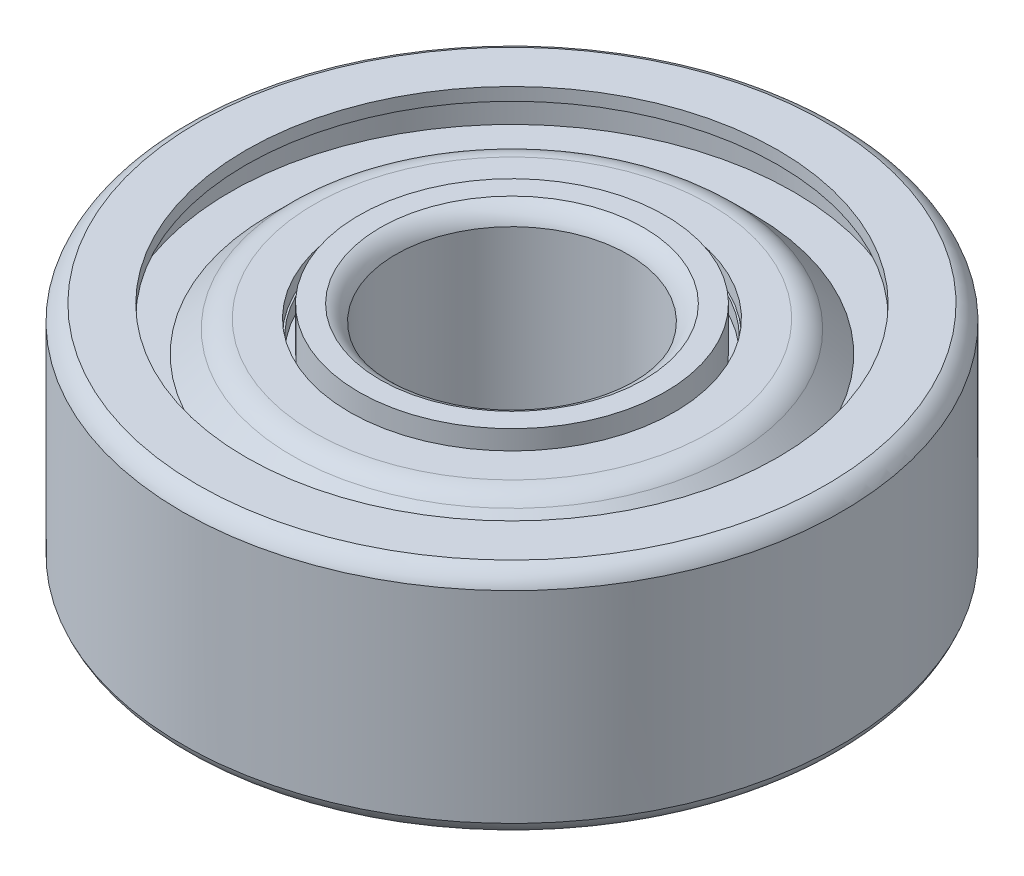
ISO-10303-21;
HEADER;
FILE_DESCRIPTION(('STEP AP214'),'2;1');
FILE_NAME('part.step','',(''),(''),'','','');
FILE_SCHEMA(('AUTOMOTIVE_DESIGN { 1 0 10303 214 1 1 1 1 }'));
ENDSEC;
DATA;
#1=APPLICATION_CONTEXT('core data for automotive mechanical design processes');
#2=APPLICATION_PROTOCOL_DEFINITION('international standard','automotive_design',2000,#1);
#3=PRODUCT_CONTEXT('',#1,'mechanical');
#4=PRODUCT('Part','Part','',(#3));
#5=PRODUCT_RELATED_PRODUCT_CATEGORY('part','',(#4));
#6=PRODUCT_DEFINITION_FORMATION('','',#4);
#7=PRODUCT_DEFINITION_CONTEXT('part definition',#1,'design');
#8=PRODUCT_DEFINITION('design','',#6,#7);
#9=PRODUCT_DEFINITION_SHAPE('','',#8);
#10=(LENGTH_UNIT() NAMED_UNIT(*) SI_UNIT(.MILLI.,.METRE.));
#11=(NAMED_UNIT(*) PLANE_ANGLE_UNIT() SI_UNIT($,.RADIAN.));
#12=(NAMED_UNIT(*) SI_UNIT($,.STERADIAN.) SOLID_ANGLE_UNIT());
#13=UNCERTAINTY_MEASURE_WITH_UNIT(LENGTH_MEASURE(1.E-05),#10,'distance_accuracy_value','');
#14=(GEOMETRIC_REPRESENTATION_CONTEXT(3) GLOBAL_UNCERTAINTY_ASSIGNED_CONTEXT((#13)) GLOBAL_UNIT_ASSIGNED_CONTEXT((#10,
#11,#12)) REPRESENTATION_CONTEXT('',''));
#15=CARTESIAN_POINT('',(0.,0.,0.));
#16=DIRECTION('',(0.,0.,1.));
#17=DIRECTION('',(1.,0.,0.));
#18=AXIS2_PLACEMENT_3D('',#15,#16,#17);
#19=CARTESIAN_POINT('',(0.,0.,0.));
#20=DIRECTION('',(0.,1.,0.));
#21=DIRECTION('',(0.,0.,1.));
#22=AXIS2_PLACEMENT_3D('',#19,#20,#21);
#23=CYLINDRICAL_SURFACE('',#22,3.);
#24=CARTESIAN_POINT('',(0.,5.60000000000008,0.));
#25=DIRECTION('',(0.,1.,0.));
#26=DIRECTION('',(0.,0.,1.));
#27=AXIS2_PLACEMENT_3D('',#24,#25,#26);
#28=CIRCLE('',#27,2.99999999999977);
#29=CARTESIAN_POINT('',(0.,5.60000000000008,2.99999999999977));
#30=VERTEX_POINT('',#29);
#31=EDGE_CURVE('E187',#30,#30,#28,.F.);
#32=ORIENTED_EDGE('',*,*,#31,.F.);
#33=EDGE_LOOP('',(#32));
#34=FACE_BOUND('',#33,.T.);
#35=CARTESIAN_POINT('',(0.,0.399999999999939,0.));
#36=DIRECTION('',(0.,-1.,0.));
#37=DIRECTION('',(0.,0.,1.));
#38=AXIS2_PLACEMENT_3D('',#35,#36,#37);
#39=CIRCLE('',#38,2.99999999999983);
#40=CARTESIAN_POINT('',(0.,0.399999999999939,2.99999999999983));
#41=VERTEX_POINT('',#40);
#42=EDGE_CURVE('E183',#41,#41,#39,.F.);
#43=ORIENTED_EDGE('',*,*,#42,.F.);
#44=EDGE_LOOP('',(#43));
#45=FACE_BOUND('',#44,.T.);
#46=ADVANCED_FACE('F16',(#34,#45),#23,.F.);
#47=CARTESIAN_POINT('',(0.,5.36637722008,0.));
#48=DIRECTION('',(0.,1.,0.));
#49=DIRECTION('',(0.,0.,1.));
#50=AXIS2_PLACEMENT_3D('',#47,#48,#49);
#51=TOROIDAL_SURFACE('',#50,3.63362277992,0.6753202429451);
#52=ORIENTED_EDGE('',*,*,#31,.T.);
#53=EDGE_LOOP('',(#52));
#54=FACE_BOUND('',#53,.T.);
#55=CARTESIAN_POINT('',(0.,6.,0.));
#56=DIRECTION('',(0.,1.,0.));
#57=DIRECTION('',(0.,0.,1.));
#58=AXIS2_PLACEMENT_3D('',#55,#56,#57);
#59=CIRCLE('',#58,3.39999999999929);
#60=CARTESIAN_POINT('',(0.,6.,3.39999999999929));
#61=VERTEX_POINT('',#60);
#62=EDGE_CURVE('E186',#61,#61,#59,.F.);
#63=ORIENTED_EDGE('',*,*,#62,.F.);
#64=EDGE_LOOP('',(#63));
#65=FACE_BOUND('',#64,.T.);
#66=ADVANCED_FACE('F177',(#54,#65),#51,.T.);
#67=CARTESIAN_POINT('',(0.,0.6336227799202,0.));
#68=DIRECTION('',(0.,-1.,0.));
#69=DIRECTION('',(0.,0.,1.));
#70=AXIS2_PLACEMENT_3D('',#67,#68,#69);
#71=TOROIDAL_SURFACE('',#70,3.63362277992,0.6753202429451);
#72=ORIENTED_EDGE('',*,*,#42,.T.);
#73=EDGE_LOOP('',(#72));
#74=FACE_BOUND('',#73,.T.);
#75=CARTESIAN_POINT('',(0.,0.,0.));
#76=DIRECTION('',(0.,-1.,0.));
#77=DIRECTION('',(0.,0.,-1.));
#78=AXIS2_PLACEMENT_3D('',#75,#76,#77);
#79=CIRCLE('',#78,3.39999999999983);
#80=CARTESIAN_POINT('',(0.,0.,-3.39999999999983));
#81=VERTEX_POINT('',#80);
#82=EDGE_CURVE('E262',#81,#81,#79,.T.);
#83=ORIENTED_EDGE('',*,*,#82,.T.);
#84=EDGE_LOOP('',(#83));
#85=FACE_BOUND('',#84,.T.);
#86=ADVANCED_FACE('F174',(#74,#85),#71,.T.);
#87=CARTESIAN_POINT('',(0.,6.,0.));
#88=DIRECTION('',(0.,1.,0.));
#89=DIRECTION('',(0.,0.,1.));
#90=AXIS2_PLACEMENT_3D('',#87,#88,#89);
#91=PLANE('',#90);
#92=ORIENTED_EDGE('',*,*,#62,.T.);
#93=EDGE_LOOP('',(#92));
#94=FACE_BOUND('',#93,.T.);
#95=CARTESIAN_POINT('',(0.,6.,0.));
#96=DIRECTION('',(0.,1.,0.));
#97=DIRECTION('',(0.,0.,1.));
#98=AXIS2_PLACEMENT_3D('',#95,#96,#97);
#99=CIRCLE('',#98,3.948957610706);
#100=CARTESIAN_POINT('',(0.,6.,3.948957610706));
#101=VERTEX_POINT('',#100);
#102=EDGE_CURVE('E259',#101,#101,#99,.F.);
#103=ORIENTED_EDGE('',*,*,#102,.F.);
#104=EDGE_LOOP('',(#103));
#105=FACE_BOUND('',#104,.T.);
#106=ADVANCED_FACE('F170',(#94,#105),#91,.T.);
#107=CARTESIAN_POINT('',(0.,0.,0.));
#108=DIRECTION('',(0.,1.,0.));
#109=DIRECTION('',(0.,0.,1.));
#110=AXIS2_PLACEMENT_3D('',#107,#108,#109);
#111=PLANE('',#110);
#112=ORIENTED_EDGE('',*,*,#82,.F.);
#113=EDGE_LOOP('',(#112));
#114=FACE_BOUND('',#113,.T.);
#115=CARTESIAN_POINT('',(0.,0.,0.));
#116=DIRECTION('',(0.,-1.,0.));
#117=DIRECTION('',(0.,0.,-1.));
#118=AXIS2_PLACEMENT_3D('',#115,#116,#117);
#119=CIRCLE('',#118,3.948957610706);
#120=CARTESIAN_POINT('',(0.,0.,-3.948957610706));
#121=VERTEX_POINT('',#120);
#122=EDGE_CURVE('E256',#121,#121,#119,.F.);
#123=ORIENTED_EDGE('',*,*,#122,.F.);
#124=EDGE_LOOP('',(#123));
#125=FACE_BOUND('',#124,.T.);
#126=ADVANCED_FACE('F166',(#114,#125),#111,.F.);
#127=CARTESIAN_POINT('',(0.,5.6698,0.));
#128=DIRECTION('',(0.,1.,0.));
#129=DIRECTION('',(0.,0.,1.));
#130=AXIS2_PLACEMENT_3D('',#127,#128,#129);
#131=CYLINDRICAL_SURFACE('',#130,3.948957610706);
#132=ORIENTED_EDGE('',*,*,#102,.T.);
#133=EDGE_LOOP('',(#132));
#134=FACE_BOUND('',#133,.T.);
#135=CARTESIAN_POINT('',(0.,4.8698,0.));
#136=DIRECTION('',(0.,1.,0.));
#137=DIRECTION('',(0.,0.,1.));
#138=AXIS2_PLACEMENT_3D('',#135,#136,#137);
#139=CIRCLE('',#138,3.948957610706);
#140=CARTESIAN_POINT('',(0.,4.8698,3.948957610706));
#141=VERTEX_POINT('',#140);
#142=EDGE_CURVE('E253',#141,#141,#139,.F.);
#143=ORIENTED_EDGE('',*,*,#142,.F.);
#144=EDGE_LOOP('',(#143));
#145=FACE_BOUND('',#144,.T.);
#146=ADVANCED_FACE('F162',(#134,#145),#131,.T.);
#147=CARTESIAN_POINT('',(0.,0.3302,0.));
#148=DIRECTION('',(0.,-1.,0.));
#149=DIRECTION('',(0.,0.,-1.));
#150=AXIS2_PLACEMENT_3D('',#147,#148,#149);
#151=CYLINDRICAL_SURFACE('',#150,3.948957610706);
#152=ORIENTED_EDGE('',*,*,#122,.T.);
#153=EDGE_LOOP('',(#152));
#154=FACE_BOUND('',#153,.T.);
#155=CARTESIAN_POINT('',(0.,1.1302,0.));
#156=DIRECTION('',(0.,-1.,0.));
#157=DIRECTION('',(0.,0.,-1.));
#158=AXIS2_PLACEMENT_3D('',#155,#156,#157);
#159=CIRCLE('',#158,3.948957610706);
#160=CARTESIAN_POINT('',(0.,1.1302,-3.948957610706));
#161=VERTEX_POINT('',#160);
#162=EDGE_CURVE('E250',#161,#161,#159,.F.);
#163=ORIENTED_EDGE('',*,*,#162,.F.);
#164=EDGE_LOOP('',(#163));
#165=FACE_BOUND('',#164,.T.);
#166=ADVANCED_FACE('F158',(#154,#165),#151,.T.);
#167=CARTESIAN_POINT('',(0.,4.8698,0.));
#168=DIRECTION('',(0.,1.,0.));
#169=DIRECTION('',(0.,0.,1.));
#170=AXIS2_PLACEMENT_3D('',#167,#168,#169);
#171=PLANE('',#170);
#172=ORIENTED_EDGE('',*,*,#142,.T.);
#173=EDGE_LOOP('',(#172));
#174=FACE_BOUND('',#173,.T.);
#175=CARTESIAN_POINT('',(0.,4.8698,0.));
#176=DIRECTION('',(0.,1.,0.));
#177=DIRECTION('',(0.,0.,1.));
#178=AXIS2_PLACEMENT_3D('',#175,#176,#177);
#179=CIRCLE('',#178,4.145752180368);
#180=CARTESIAN_POINT('',(0.,4.8698,4.145752180368));
#181=VERTEX_POINT('',#180);
#182=EDGE_CURVE('E247',#181,#181,#179,.T.);
#183=ORIENTED_EDGE('',*,*,#182,.T.);
#184=EDGE_LOOP('',(#183));
#185=FACE_BOUND('',#184,.T.);
#186=ADVANCED_FACE('F154',(#174,#185),#171,.T.);
#187=CARTESIAN_POINT('',(0.,1.1302,0.));
#188=DIRECTION('',(0.,-1.,0.));
#189=DIRECTION('',(0.,0.,-1.));
#190=AXIS2_PLACEMENT_3D('',#187,#188,#189);
#191=PLANE('',#190);
#192=ORIENTED_EDGE('',*,*,#162,.T.);
#193=EDGE_LOOP('',(#192));
#194=FACE_BOUND('',#193,.T.);
#195=CARTESIAN_POINT('',(0.,1.1302,0.));
#196=DIRECTION('',(0.,-1.,0.));
#197=DIRECTION('',(0.,0.,-1.));
#198=AXIS2_PLACEMENT_3D('',#195,#196,#197);
#199=CIRCLE('',#198,4.145752180368);
#200=CARTESIAN_POINT('',(0.,1.1302,-4.145752180368));
#201=VERTEX_POINT('',#200);
#202=EDGE_CURVE('E244',#201,#201,#199,.T.);
#203=ORIENTED_EDGE('',*,*,#202,.T.);
#204=EDGE_LOOP('',(#203));
#205=FACE_BOUND('',#204,.T.);
#206=ADVANCED_FACE('F150',(#194,#205),#191,.T.);
#207=CARTESIAN_POINT('',(0.,4.8698,0.));
#208=DIRECTION('',(0.,1.,0.));
#209=DIRECTION('',(0.,0.,1.));
#210=AXIS2_PLACEMENT_3D('',#207,#208,#209);
#211=CYLINDRICAL_SURFACE('',#210,4.145752180368);
#212=CARTESIAN_POINT('',(0.,5.2698,0.));
#213=DIRECTION('',(0.,1.,0.));
#214=DIRECTION('',(0.,0.,1.));
#215=AXIS2_PLACEMENT_3D('',#212,#213,#214);
#216=CIRCLE('',#215,4.145752180368);
#217=CARTESIAN_POINT('',(0.,5.2698,4.145752180368));
#218=VERTEX_POINT('',#217);
#219=EDGE_CURVE('E241',#218,#218,#216,.F.);
#220=ORIENTED_EDGE('',*,*,#219,.F.);
#221=EDGE_LOOP('',(#220));
#222=FACE_BOUND('',#221,.T.);
#223=ORIENTED_EDGE('',*,*,#182,.F.);
#224=EDGE_LOOP('',(#223));
#225=FACE_BOUND('',#224,.T.);
#226=ADVANCED_FACE('F146',(#222,#225),#211,.F.);
#227=CARTESIAN_POINT('',(0.,1.1302,0.));
#228=DIRECTION('',(0.,-1.,0.));
#229=DIRECTION('',(0.,0.,-1.));
#230=AXIS2_PLACEMENT_3D('',#227,#228,#229);
#231=CYLINDRICAL_SURFACE('',#230,4.145752180368);
#232=CARTESIAN_POINT('',(0.,0.7302,0.));
#233=DIRECTION('',(0.,-1.,0.));
#234=DIRECTION('',(0.,0.,-1.));
#235=AXIS2_PLACEMENT_3D('',#232,#233,#234);
#236=CIRCLE('',#235,4.145752180368);
#237=CARTESIAN_POINT('',(0.,0.7302,-4.145752180368));
#238=VERTEX_POINT('',#237);
#239=EDGE_CURVE('E238',#238,#238,#236,.F.);
#240=ORIENTED_EDGE('',*,*,#239,.F.);
#241=EDGE_LOOP('',(#240));
#242=FACE_BOUND('',#241,.T.);
#243=ORIENTED_EDGE('',*,*,#202,.F.);
#244=EDGE_LOOP('',(#243));
#245=FACE_BOUND('',#244,.T.);
#246=ADVANCED_FACE('F142',(#242,#245),#231,.F.);
#247=CARTESIAN_POINT('',(0.,5.2698,0.));
#248=DIRECTION('',(0.,1.,0.));
#249=DIRECTION('',(0.,0.,1.));
#250=AXIS2_PLACEMENT_3D('',#247,#248,#249);
#251=PLANE('',#250);
#252=ORIENTED_EDGE('',*,*,#219,.T.);
#253=EDGE_LOOP('',(#252));
#254=FACE_BOUND('',#253,.T.);
#255=CARTESIAN_POINT('',(0.,5.2698,0.));
#256=DIRECTION('',(0.,1.,0.));
#257=DIRECTION('',(0.,0.,1.));
#258=AXIS2_PLACEMENT_3D('',#255,#256,#257);
#259=CIRCLE('',#258,4.186537805483);
#260=CARTESIAN_POINT('',(0.,5.2698,4.186537805483));
#261=VERTEX_POINT('',#260);
#262=EDGE_CURVE('E235',#261,#261,#259,.T.);
#263=ORIENTED_EDGE('',*,*,#262,.T.);
#264=EDGE_LOOP('',(#263));
#265=FACE_BOUND('',#264,.T.);
#266=ADVANCED_FACE('F138',(#254,#265),#251,.T.);
#267=CARTESIAN_POINT('',(0.,0.7302,0.));
#268=DIRECTION('',(0.,-1.,0.));
#269=DIRECTION('',(0.,0.,-1.));
#270=AXIS2_PLACEMENT_3D('',#267,#268,#269);
#271=PLANE('',#270);
#272=ORIENTED_EDGE('',*,*,#239,.T.);
#273=EDGE_LOOP('',(#272));
#274=FACE_BOUND('',#273,.T.);
#275=CARTESIAN_POINT('',(0.,0.7302,0.));
#276=DIRECTION('',(0.,-1.,0.));
#277=DIRECTION('',(0.,0.,-1.));
#278=AXIS2_PLACEMENT_3D('',#275,#276,#277);
#279=CIRCLE('',#278,4.186537805483);
#280=CARTESIAN_POINT('',(0.,0.7302,-4.186537805483));
#281=VERTEX_POINT('',#280);
#282=EDGE_CURVE('E232',#281,#281,#279,.T.);
#283=ORIENTED_EDGE('',*,*,#282,.T.);
#284=EDGE_LOOP('',(#283));
#285=FACE_BOUND('',#284,.T.);
#286=ADVANCED_FACE('F134',(#274,#285),#271,.T.);
#287=CARTESIAN_POINT('',(0.,5.2698,0.));
#288=DIRECTION('',(0.,1.,0.));
#289=DIRECTION('',(0.,0.,1.));
#290=AXIS2_PLACEMENT_3D('',#287,#288,#289);
#291=CYLINDRICAL_SURFACE('',#290,4.186537805483);
#292=CARTESIAN_POINT('',(0.,5.6698,0.));
#293=DIRECTION('',(0.,1.,0.));
#294=DIRECTION('',(0.,0.,1.));
#295=AXIS2_PLACEMENT_3D('',#292,#293,#294);
#296=CIRCLE('',#295,4.186537805483);
#297=CARTESIAN_POINT('',(0.,5.6698,4.186537805483));
#298=VERTEX_POINT('',#297);
#299=EDGE_CURVE('E229',#298,#298,#296,.F.);
#300=ORIENTED_EDGE('',*,*,#299,.F.);
#301=EDGE_LOOP('',(#300));
#302=FACE_BOUND('',#301,.T.);
#303=ORIENTED_EDGE('',*,*,#262,.F.);
#304=EDGE_LOOP('',(#303));
#305=FACE_BOUND('',#304,.T.);
#306=ADVANCED_FACE('F130',(#302,#305),#291,.F.);
#307=CARTESIAN_POINT('',(0.,0.7302,0.));
#308=DIRECTION('',(0.,-1.,0.));
#309=DIRECTION('',(0.,0.,-1.));
#310=AXIS2_PLACEMENT_3D('',#307,#308,#309);
#311=CYLINDRICAL_SURFACE('',#310,4.186537805483);
#312=CARTESIAN_POINT('',(0.,0.3302,0.));
#313=DIRECTION('',(0.,-1.,0.));
#314=DIRECTION('',(0.,0.,-1.));
#315=AXIS2_PLACEMENT_3D('',#312,#313,#314);
#316=CIRCLE('',#315,4.186537805483);
#317=CARTESIAN_POINT('',(0.,0.3302,-4.186537805483));
#318=VERTEX_POINT('',#317);
#319=EDGE_CURVE('E51',#318,#318,#316,.F.);
#320=ORIENTED_EDGE('',*,*,#319,.F.);
#321=EDGE_LOOP('',(#320));
#322=FACE_BOUND('',#321,.T.);
#323=ORIENTED_EDGE('',*,*,#282,.F.);
#324=EDGE_LOOP('',(#323));
#325=FACE_BOUND('',#324,.T.);
#326=ADVANCED_FACE('F125',(#322,#325),#311,.F.);
#327=CARTESIAN_POINT('',(0.,5.6698,0.));
#328=DIRECTION('',(0.,1.,0.));
#329=DIRECTION('',(0.,0.,1.));
#330=AXIS2_PLACEMENT_3D('',#327,#328,#329);
#331=PLANE('',#330);
#332=ORIENTED_EDGE('',*,*,#299,.T.);
#333=EDGE_LOOP('',(#332));
#334=FACE_BOUND('',#333,.T.);
#335=CARTESIAN_POINT('',(0.,5.6698,0.));
#336=DIRECTION('',(0.,-1.,0.));
#337=DIRECTION('',(0.,0.,1.));
#338=AXIS2_PLACEMENT_3D('',#335,#336,#337);
#339=CIRCLE('',#338,5.102454019466);
#340=CARTESIAN_POINT('',(0.,5.6698,5.102454019466));
#341=VERTEX_POINT('',#340);
#342=CARTESIAN_POINT('',(0.,5.6698,-5.102454019466));
#343=VERTEX_POINT('',#342);
#344=EDGE_CURVE('E49',#341,#343,#339,.T.);
#345=ORIENTED_EDGE('',*,*,#344,.F.);
#346=CARTESIAN_POINT('',(0.,5.6698,0.));
#347=DIRECTION('',(0.,-1.,0.));
#348=DIRECTION('',(0.,0.,-1.));
#349=AXIS2_PLACEMENT_3D('',#346,#347,#348);
#350=CIRCLE('',#349,5.102454019466);
#351=EDGE_CURVE('E44',#343,#341,#350,.T.);
#352=ORIENTED_EDGE('',*,*,#351,.F.);
#353=EDGE_LOOP('',(#345,#352));
#354=FACE_BOUND('',#353,.T.);
#355=ADVANCED_FACE('F48',(#334,#354),#331,.T.);
#356=CARTESIAN_POINT('',(0.,0.3302,0.));
#357=DIRECTION('',(0.,-1.,0.));
#358=DIRECTION('',(0.,0.,-1.));
#359=AXIS2_PLACEMENT_3D('',#356,#357,#358);
#360=PLANE('',#359);
#361=ORIENTED_EDGE('',*,*,#319,.T.);
#362=EDGE_LOOP('',(#361));
#363=FACE_BOUND('',#362,.T.);
#364=CARTESIAN_POINT('',(0.,0.3302,0.));
#365=DIRECTION('',(0.,1.,0.));
#366=DIRECTION('',(0.,0.,-1.));
#367=AXIS2_PLACEMENT_3D('',#364,#365,#366);
#368=CIRCLE('',#367,5.102454019466);
#369=CARTESIAN_POINT('',(0.,0.3302,-5.102454019466));
#370=VERTEX_POINT('',#369);
#371=CARTESIAN_POINT('',(0.,0.3302,5.102454019466));
#372=VERTEX_POINT('',#371);
#373=EDGE_CURVE('E35',#370,#372,#368,.T.);
#374=ORIENTED_EDGE('',*,*,#373,.F.);
#375=CARTESIAN_POINT('',(0.,0.3302,0.));
#376=DIRECTION('',(0.,1.,0.));
#377=DIRECTION('',(0.,0.,1.));
#378=AXIS2_PLACEMENT_3D('',#375,#376,#377);
#379=CIRCLE('',#378,5.102454019466);
#380=EDGE_CURVE('E97',#372,#370,#379,.T.);
#381=ORIENTED_EDGE('',*,*,#380,.F.);
#382=EDGE_LOOP('',(#374,#381));
#383=FACE_BOUND('',#382,.T.);
#384=ADVANCED_FACE('F77',(#363,#383),#360,.T.);
#385=CARTESIAN_POINT('',(0.,4.8698,0.));
#386=DIRECTION('',(0.,1.,0.));
#387=DIRECTION('',(0.,0.,1.));
#388=AXIS2_PLACEMENT_3D('',#385,#386,#387);
#389=TOROIDAL_SURFACE('',#388,5.102454019466,0.8);
#390=ORIENTED_EDGE('',*,*,#351,.T.);
#391=ORIENTED_EDGE('',*,*,#344,.T.);
#392=EDGE_LOOP('',(#390,#391));
#393=FACE_BOUND('',#392,.T.);
#394=CARTESIAN_POINT('',(0.,5.43548542492545,0.));
#395=DIRECTION('',(0.,-1.,0.));
#396=DIRECTION('',(0.,0.,-1.));
#397=AXIS2_PLACEMENT_3D('',#394,#395,#396);
#398=CIRCLE('',#397,5.6681394445377);
#399=CARTESIAN_POINT('',(0.,5.43548542492545,-5.6681394445377));
#400=VERTEX_POINT('',#399);
#401=EDGE_CURVE('E85',#400,#400,#398,.T.);
#402=ORIENTED_EDGE('',*,*,#401,.F.);
#403=EDGE_LOOP('',(#402));
#404=FACE_BOUND('',#403,.T.);
#405=ADVANCED_FACE('F55',(#393,#404),#389,.T.);
#406=CARTESIAN_POINT('',(0.,1.1302,0.));
#407=DIRECTION('',(0.,-1.,0.));
#408=DIRECTION('',(0.,0.,-1.));
#409=AXIS2_PLACEMENT_3D('',#406,#407,#408);
#410=TOROIDAL_SURFACE('',#409,5.102454019466,0.8);
#411=ORIENTED_EDGE('',*,*,#373,.T.);
#412=ORIENTED_EDGE('',*,*,#380,.T.);
#413=EDGE_LOOP('',(#411,#412));
#414=FACE_BOUND('',#413,.T.);
#415=CARTESIAN_POINT('',(0.,0.56451457504636,0.));
#416=DIRECTION('',(0.,1.,0.));
#417=DIRECTION('',(0.,0.,1.));
#418=AXIS2_PLACEMENT_3D('',#415,#416,#417);
#419=CIRCLE('',#418,5.66813944442401);
#420=CARTESIAN_POINT('',(0.,0.56451457504636,5.66813944442401));
#421=VERTEX_POINT('',#420);
#422=EDGE_CURVE('E226',#421,#421,#419,.T.);
#423=ORIENTED_EDGE('',*,*,#422,.F.);
#424=EDGE_LOOP('',(#423));
#425=FACE_BOUND('',#424,.T.);
#426=ADVANCED_FACE('F76',(#414,#425),#410,.T.);
#427=CARTESIAN_POINT('',(0.,4.86980000010817,0.));
#428=DIRECTION('',(0.,-1.,0.));
#429=DIRECTION('',(0.,0.,-1.));
#430=AXIS2_PLACEMENT_3D('',#427,#428,#429);
#431=CONICAL_SURFACE('',#430,6.23382486935498,0.785398163397448);
#432=CARTESIAN_POINT('',(0.,4.86980000005133,0.));
#433=DIRECTION('',(0.,-1.,0.));
#434=DIRECTION('',(0.,0.,-1.));
#435=AXIS2_PLACEMENT_3D('',#432,#433,#434);
#436=CIRCLE('',#435,6.23382486941182);
#437=CARTESIAN_POINT('',(0.,4.86980000005133,-6.23382486941182));
#438=VERTEX_POINT('',#437);
#439=EDGE_CURVE('E223',#438,#438,#436,.T.);
#440=ORIENTED_EDGE('',*,*,#439,.F.);
#441=EDGE_LOOP('',(#440));
#442=FACE_BOUND('',#441,.T.);
#443=ORIENTED_EDGE('',*,*,#401,.T.);
#444=EDGE_LOOP('',(#443));
#445=FACE_BOUND('',#444,.T.);
#446=ADVANCED_FACE('F339',(#442,#445),#431,.T.);
#447=CARTESIAN_POINT('',(0.,1.13019999986363,0.));
#448=DIRECTION('',(0.,1.,0.));
#449=DIRECTION('',(0.,0.,1.));
#450=AXIS2_PLACEMENT_3D('',#447,#448,#449);
#451=CONICAL_SURFACE('',#450,6.23382486924129,0.785398163397448);
#452=CARTESIAN_POINT('',(0.,1.13019999997732,0.));
#453=DIRECTION('',(0.,1.,0.));
#454=DIRECTION('',(0.,0.,1.));
#455=AXIS2_PLACEMENT_3D('',#452,#453,#454);
#456=CIRCLE('',#455,6.23382486935498);
#457=CARTESIAN_POINT('',(0.,1.13019999997732,6.23382486935498));
#458=VERTEX_POINT('',#457);
#459=EDGE_CURVE('E220',#458,#458,#456,.T.);
#460=ORIENTED_EDGE('',*,*,#459,.F.);
#461=EDGE_LOOP('',(#460));
#462=FACE_BOUND('',#461,.T.);
#463=ORIENTED_EDGE('',*,*,#422,.T.);
#464=EDGE_LOOP('',(#463));
#465=FACE_BOUND('',#464,.T.);
#466=ADVANCED_FACE('F336',(#462,#465),#451,.T.);
#467=CARTESIAN_POINT('',(0.,4.8698,0.));
#468=DIRECTION('',(0.,1.,0.));
#469=DIRECTION('',(0.,0.,1.));
#470=AXIS2_PLACEMENT_3D('',#467,#468,#469);
#471=PLANE('',#470);
#472=ORIENTED_EDGE('',*,*,#439,.T.);
#473=EDGE_LOOP('',(#472));
#474=FACE_BOUND('',#473,.T.);
#475=CARTESIAN_POINT('',(0.,4.8698,0.));
#476=DIRECTION('',(0.,1.,0.));
#477=DIRECTION('',(0.,0.,1.));
#478=AXIS2_PLACEMENT_3D('',#475,#476,#477);
#479=CIRCLE('',#478,7.262175820468);
#480=CARTESIAN_POINT('',(0.,4.8698,7.262175820468));
#481=VERTEX_POINT('',#480);
#482=EDGE_CURVE('E217',#481,#481,#479,.T.);
#483=ORIENTED_EDGE('',*,*,#482,.T.);
#484=EDGE_LOOP('',(#483));
#485=FACE_BOUND('',#484,.T.);
#486=ADVANCED_FACE('F332',(#474,#485),#471,.T.);
#487=CARTESIAN_POINT('',(0.,1.1302,0.));
#488=DIRECTION('',(0.,-1.,0.));
#489=DIRECTION('',(0.,0.,-1.));
#490=AXIS2_PLACEMENT_3D('',#487,#488,#489);
#491=PLANE('',#490);
#492=ORIENTED_EDGE('',*,*,#459,.T.);
#493=EDGE_LOOP('',(#492));
#494=FACE_BOUND('',#493,.T.);
#495=CARTESIAN_POINT('',(0.,1.1302,0.));
#496=DIRECTION('',(0.,-1.,0.));
#497=DIRECTION('',(0.,0.,-1.));
#498=AXIS2_PLACEMENT_3D('',#495,#496,#497);
#499=CIRCLE('',#498,7.262175820468);
#500=CARTESIAN_POINT('',(0.,1.1302,-7.262175820468));
#501=VERTEX_POINT('',#500);
#502=EDGE_CURVE('E214',#501,#501,#499,.T.);
#503=ORIENTED_EDGE('',*,*,#502,.T.);
#504=EDGE_LOOP('',(#503));
#505=FACE_BOUND('',#504,.T.);
#506=ADVANCED_FACE('F328',(#494,#505),#491,.T.);
#507=CARTESIAN_POINT('',(0.,4.8698,0.));
#508=DIRECTION('',(0.,1.,0.));
#509=DIRECTION('',(0.,0.,1.));
#510=AXIS2_PLACEMENT_3D('',#507,#508,#509);
#511=CYLINDRICAL_SURFACE('',#510,7.262175820468);
#512=CARTESIAN_POINT('',(0.,5.6698,0.));
#513=DIRECTION('',(0.,1.,0.));
#514=DIRECTION('',(0.,0.,1.));
#515=AXIS2_PLACEMENT_3D('',#512,#513,#514);
#516=CIRCLE('',#515,7.262175820468);
#517=CARTESIAN_POINT('',(0.,5.6698,7.262175820468));
#518=VERTEX_POINT('',#517);
#519=EDGE_CURVE('E211',#518,#518,#516,.T.);
#520=ORIENTED_EDGE('',*,*,#519,.T.);
#521=EDGE_LOOP('',(#520));
#522=FACE_BOUND('',#521,.T.);
#523=ORIENTED_EDGE('',*,*,#482,.F.);
#524=EDGE_LOOP('',(#523));
#525=FACE_BOUND('',#524,.T.);
#526=ADVANCED_FACE('F324',(#522,#525),#511,.F.);
#527=CARTESIAN_POINT('',(0.,1.1302,0.));
#528=DIRECTION('',(0.,-1.,0.));
#529=DIRECTION('',(0.,0.,-1.));
#530=AXIS2_PLACEMENT_3D('',#527,#528,#529);
#531=CYLINDRICAL_SURFACE('',#530,7.262175820468);
#532=CARTESIAN_POINT('',(0.,0.3302,0.));
#533=DIRECTION('',(0.,-1.,0.));
#534=DIRECTION('',(0.,0.,-1.));
#535=AXIS2_PLACEMENT_3D('',#532,#533,#534);
#536=CIRCLE('',#535,7.262175820468);
#537=CARTESIAN_POINT('',(0.,0.3302,-7.262175820468));
#538=VERTEX_POINT('',#537);
#539=EDGE_CURVE('E208',#538,#538,#536,.T.);
#540=ORIENTED_EDGE('',*,*,#539,.T.);
#541=EDGE_LOOP('',(#540));
#542=FACE_BOUND('',#541,.T.);
#543=ORIENTED_EDGE('',*,*,#502,.F.);
#544=EDGE_LOOP('',(#543));
#545=FACE_BOUND('',#544,.T.);
#546=ADVANCED_FACE('F320',(#542,#545),#531,.F.);
#547=CARTESIAN_POINT('',(0.,5.6698,0.));
#548=DIRECTION('',(0.,1.,0.));
#549=DIRECTION('',(0.,0.,1.));
#550=AXIS2_PLACEMENT_3D('',#547,#548,#549);
#551=PLANE('',#550);
#552=CARTESIAN_POINT('',(0.,5.6698,0.));
#553=DIRECTION('',(0.,1.,0.));
#554=DIRECTION('',(0.,0.,1.));
#555=AXIS2_PLACEMENT_3D('',#552,#553,#554);
#556=CIRCLE('',#555,6.862175820468);
#557=CARTESIAN_POINT('',(0.,5.6698,6.862175820468));
#558=VERTEX_POINT('',#557);
#559=EDGE_CURVE('E205',#558,#558,#556,.T.);
#560=ORIENTED_EDGE('',*,*,#559,.T.);
#561=EDGE_LOOP('',(#560));
#562=FACE_BOUND('',#561,.T.);
#563=ORIENTED_EDGE('',*,*,#519,.F.);
#564=EDGE_LOOP('',(#563));
#565=FACE_BOUND('',#564,.T.);
#566=ADVANCED_FACE('F316',(#562,#565),#551,.F.);
#567=CARTESIAN_POINT('',(0.,0.3302,0.));
#568=DIRECTION('',(0.,-1.,0.));
#569=DIRECTION('',(0.,0.,-1.));
#570=AXIS2_PLACEMENT_3D('',#567,#568,#569);
#571=PLANE('',#570);
#572=CARTESIAN_POINT('',(0.,0.3302,0.));
#573=DIRECTION('',(0.,-1.,0.));
#574=DIRECTION('',(0.,0.,-1.));
#575=AXIS2_PLACEMENT_3D('',#572,#573,#574);
#576=CIRCLE('',#575,6.862175820468);
#577=CARTESIAN_POINT('',(0.,0.3302,-6.862175820468));
#578=VERTEX_POINT('',#577);
#579=EDGE_CURVE('E202',#578,#578,#576,.T.);
#580=ORIENTED_EDGE('',*,*,#579,.T.);
#581=EDGE_LOOP('',(#580));
#582=FACE_BOUND('',#581,.T.);
#583=ORIENTED_EDGE('',*,*,#539,.F.);
#584=EDGE_LOOP('',(#583));
#585=FACE_BOUND('',#584,.T.);
#586=ADVANCED_FACE('F312',(#582,#585),#571,.F.);
#587=CARTESIAN_POINT('',(0.,5.6698,0.));
#588=DIRECTION('',(0.,1.,0.));
#589=DIRECTION('',(0.,0.,1.));
#590=AXIS2_PLACEMENT_3D('',#587,#588,#589);
#591=CYLINDRICAL_SURFACE('',#590,6.862175820468);
#592=CARTESIAN_POINT('',(0.,6.,0.));
#593=DIRECTION('',(0.,1.,0.));
#594=DIRECTION('',(0.,0.,1.));
#595=AXIS2_PLACEMENT_3D('',#592,#593,#594);
#596=CIRCLE('',#595,6.862175820468);
#597=CARTESIAN_POINT('',(0.,6.,6.862175820468));
#598=VERTEX_POINT('',#597);
#599=EDGE_CURVE('E199',#598,#598,#596,.F.);
#600=ORIENTED_EDGE('',*,*,#599,.F.);
#601=EDGE_LOOP('',(#600));
#602=FACE_BOUND('',#601,.T.);
#603=ORIENTED_EDGE('',*,*,#559,.F.);
#604=EDGE_LOOP('',(#603));
#605=FACE_BOUND('',#604,.T.);
#606=ADVANCED_FACE('F308',(#602,#605),#591,.F.);
#607=CARTESIAN_POINT('',(0.,0.3302,0.));
#608=DIRECTION('',(0.,-1.,0.));
#609=DIRECTION('',(0.,0.,-1.));
#610=AXIS2_PLACEMENT_3D('',#607,#608,#609);
#611=CYLINDRICAL_SURFACE('',#610,6.862175820468);
#612=CARTESIAN_POINT('',(0.,0.,0.));
#613=DIRECTION('',(0.,-1.,0.));
#614=DIRECTION('',(0.,0.,-1.));
#615=AXIS2_PLACEMENT_3D('',#612,#613,#614);
#616=CIRCLE('',#615,6.862175820468);
#617=CARTESIAN_POINT('',(0.,0.,-6.862175820468));
#618=VERTEX_POINT('',#617);
#619=EDGE_CURVE('E196',#618,#618,#616,.T.);
#620=ORIENTED_EDGE('',*,*,#619,.T.);
#621=EDGE_LOOP('',(#620));
#622=FACE_BOUND('',#621,.T.);
#623=ORIENTED_EDGE('',*,*,#579,.F.);
#624=EDGE_LOOP('',(#623));
#625=FACE_BOUND('',#624,.T.);
#626=ADVANCED_FACE('F304',(#622,#625),#611,.F.);
#627=CARTESIAN_POINT('',(0.,6.,0.));
#628=DIRECTION('',(0.,1.,0.));
#629=DIRECTION('',(0.,0.,1.));
#630=AXIS2_PLACEMENT_3D('',#627,#628,#629);
#631=PLANE('',#630);
#632=ORIENTED_EDGE('',*,*,#599,.T.);
#633=EDGE_LOOP('',(#632));
#634=FACE_BOUND('',#633,.T.);
#635=CARTESIAN_POINT('',(0.,6.,0.));
#636=DIRECTION('',(0.,1.,0.));
#637=DIRECTION('',(0.,0.,1.));
#638=AXIS2_PLACEMENT_3D('',#635,#636,#637);
#639=CIRCLE('',#638,8.10000000000071);
#640=CARTESIAN_POINT('',(0.,6.,8.10000000000071));
#641=VERTEX_POINT('',#640);
#642=EDGE_CURVE('E193',#641,#641,#639,.F.);
#643=ORIENTED_EDGE('',*,*,#642,.F.);
#644=EDGE_LOOP('',(#643));
#645=FACE_BOUND('',#644,.T.);
#646=ADVANCED_FACE('F300',(#634,#645),#631,.T.);
#647=CARTESIAN_POINT('',(0.,0.,0.));
#648=DIRECTION('',(0.,1.,0.));
#649=DIRECTION('',(0.,0.,1.));
#650=AXIS2_PLACEMENT_3D('',#647,#648,#649);
#651=PLANE('',#650);
#652=ORIENTED_EDGE('',*,*,#619,.F.);
#653=EDGE_LOOP('',(#652));
#654=FACE_BOUND('',#653,.T.);
#655=CARTESIAN_POINT('',(0.,0.,0.));
#656=DIRECTION('',(0.,-1.,0.));
#657=DIRECTION('',(0.,0.,-1.));
#658=AXIS2_PLACEMENT_3D('',#655,#656,#657);
#659=CIRCLE('',#658,8.10000000000017);
#660=CARTESIAN_POINT('',(0.,0.,-8.10000000000017));
#661=VERTEX_POINT('',#660);
#662=EDGE_CURVE('E190',#661,#661,#659,.F.);
#663=ORIENTED_EDGE('',*,*,#662,.F.);
#664=EDGE_LOOP('',(#663));
#665=FACE_BOUND('',#664,.T.);
#666=ADVANCED_FACE('F295',(#654,#665),#651,.F.);
#667=CARTESIAN_POINT('',(0.,5.36637722008,0.));
#668=DIRECTION('',(0.,1.,0.));
#669=DIRECTION('',(0.,0.,1.));
#670=AXIS2_PLACEMENT_3D('',#667,#668,#669);
#671=TOROIDAL_SURFACE('',#670,7.86637722008,0.6753202429451);
#672=ORIENTED_EDGE('',*,*,#642,.T.);
#673=EDGE_LOOP('',(#672));
#674=FACE_BOUND('',#673,.T.);
#675=CARTESIAN_POINT('',(0.,5.6,0.));
#676=DIRECTION('',(0.,-1.,0.));
#677=DIRECTION('',(0.,0.,-1.));
#678=AXIS2_PLACEMENT_3D('',#675,#676,#677);
#679=CIRCLE('',#678,8.5);
#680=CARTESIAN_POINT('',(0.,5.6,-8.5));
#681=VERTEX_POINT('',#680);
#682=EDGE_CURVE('E27',#681,#681,#679,.T.);
#683=ORIENTED_EDGE('',*,*,#682,.F.);
#684=EDGE_LOOP('',(#683));
#685=FACE_BOUND('',#684,.T.);
#686=ADVANCED_FACE('F290',(#674,#685),#671,.T.);
#687=CARTESIAN_POINT('',(0.,0.6336227799202,0.));
#688=DIRECTION('',(0.,-1.,0.));
#689=DIRECTION('',(0.,0.,1.));
#690=AXIS2_PLACEMENT_3D('',#687,#688,#689);
#691=TOROIDAL_SURFACE('',#690,7.86637722008,0.6753202429451);
#692=ORIENTED_EDGE('',*,*,#662,.T.);
#693=EDGE_LOOP('',(#692));
#694=FACE_BOUND('',#693,.T.);
#695=CARTESIAN_POINT('',(0.,0.4,0.));
#696=DIRECTION('',(0.,-1.,0.));
#697=DIRECTION('',(0.,0.,-1.));
#698=AXIS2_PLACEMENT_3D('',#695,#696,#697);
#699=CIRCLE('',#698,8.5);
#700=CARTESIAN_POINT('',(0.,0.4,-8.5));
#701=VERTEX_POINT('',#700);
#702=EDGE_CURVE('E11',#701,#701,#699,.F.);
#703=ORIENTED_EDGE('',*,*,#702,.F.);
#704=EDGE_LOOP('',(#703));
#705=FACE_BOUND('',#704,.T.);
#706=ADVANCED_FACE('F294',(#694,#705),#691,.T.);
#707=CARTESIAN_POINT('',(0.,6.,0.));
#708=DIRECTION('',(0.,-1.,0.));
#709=DIRECTION('',(0.,0.,-1.));
#710=AXIS2_PLACEMENT_3D('',#707,#708,#709);
#711=CYLINDRICAL_SURFACE('',#710,8.5);
#712=ORIENTED_EDGE('',*,*,#702,.T.);
#713=EDGE_LOOP('',(#712));
#714=FACE_BOUND('',#713,.T.);
#715=ORIENTED_EDGE('',*,*,#682,.T.);
#716=EDGE_LOOP('',(#715));
#717=FACE_BOUND('',#716,.T.);
#718=ADVANCED_FACE('F348',(#714,#717),#711,.T.);
#719=CLOSED_SHELL('',(#46,#66,#86,#106,#126,#146,#166,#186,#206,#226,#246,#266,#286,#306,#326,
#355,#384,#405,#426,#446,#466,#486,#506,#526,#546,#566,#586,#606,#626,#646,#666,#686,#706,#718));
#720=MANIFOLD_SOLID_BREP('B1',#719);
#721=ADVANCED_BREP_SHAPE_REPRESENTATION('',(#18,#720),#14);
#722=SHAPE_DEFINITION_REPRESENTATION(#9,#721);
ENDSEC;
END-ISO-10303-21;
